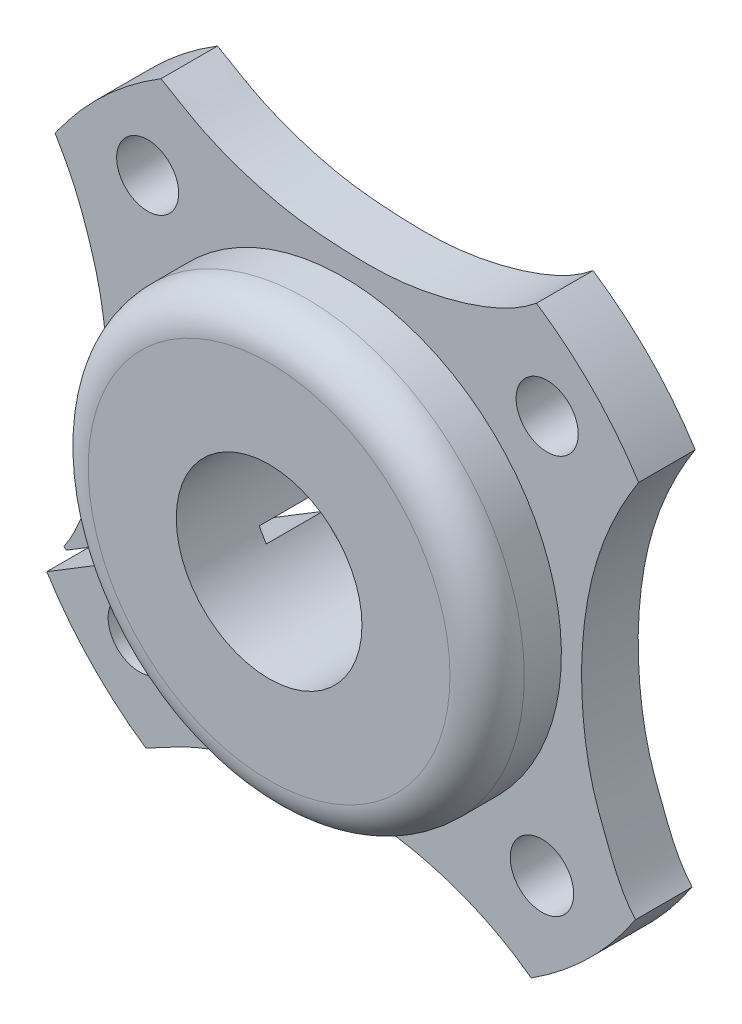
ISO-10303-21;
HEADER;
FILE_DESCRIPTION(('STEP AP214'),'2;1');
FILE_NAME('part.step','',(''),(''),'','','');
FILE_SCHEMA(('AUTOMOTIVE_DESIGN { 1 0 10303 214 1 1 1 1 }'));
ENDSEC;
DATA;
#1=APPLICATION_CONTEXT('core data for automotive mechanical design processes');
#2=APPLICATION_PROTOCOL_DEFINITION('international standard','automotive_design',2000,#1);
#3=PRODUCT_CONTEXT('',#1,'mechanical');
#4=PRODUCT('Part','Part','',(#3));
#5=PRODUCT_RELATED_PRODUCT_CATEGORY('part','',(#4));
#6=PRODUCT_DEFINITION_FORMATION('','',#4);
#7=PRODUCT_DEFINITION_CONTEXT('part definition',#1,'design');
#8=PRODUCT_DEFINITION('design','',#6,#7);
#9=PRODUCT_DEFINITION_SHAPE('','',#8);
#10=(LENGTH_UNIT() NAMED_UNIT(*) SI_UNIT(.MILLI.,.METRE.));
#11=(NAMED_UNIT(*) PLANE_ANGLE_UNIT() SI_UNIT($,.RADIAN.));
#12=(NAMED_UNIT(*) SI_UNIT($,.STERADIAN.) SOLID_ANGLE_UNIT());
#13=UNCERTAINTY_MEASURE_WITH_UNIT(LENGTH_MEASURE(1.E-05),#10,'distance_accuracy_value','');
#14=(GEOMETRIC_REPRESENTATION_CONTEXT(3) GLOBAL_UNCERTAINTY_ASSIGNED_CONTEXT((#13)) GLOBAL_UNIT_ASSIGNED_CONTEXT((#10,
#11,#12)) REPRESENTATION_CONTEXT('',''));
#15=CARTESIAN_POINT('',(0.,0.,0.));
#16=DIRECTION('',(0.,0.,1.));
#17=DIRECTION('',(1.,0.,0.));
#18=AXIS2_PLACEMENT_3D('',#15,#16,#17);
#19=CARTESIAN_POINT('',(0.658023507379732,32.5182262393393,7.62));
#20=DIRECTION('',(0.,0.,1.));
#21=DIRECTION('',(1.,0.,0.));
#22=AXIS2_PLACEMENT_3D('',#19,#20,#21);
#23=PLANE('',#22);
#24=CARTESIAN_POINT('',(0.,0.,7.62));
#25=DIRECTION('',(0.,0.,1.));
#26=DIRECTION('',(1.,0.,0.));
#27=AXIS2_PLACEMENT_3D('',#24,#25,#26);
#28=CIRCLE('',#27,29.35);
#29=CARTESIAN_POINT('',(-24.7729490374868,-15.7392342884297,7.62));
#30=VERTEX_POINT('',#29);
#31=CARTESIAN_POINT('',(-25.7376369008227,-14.1066135823382,7.62));
#32=VERTEX_POINT('',#31);
#33=EDGE_CURVE('E327',#30,#32,#28,.T.);
#34=ORIENTED_EDGE('',*,*,#33,.F.);
#35=DIRECTION('',(-0.854049752326533,-0.520191330714947,0.));
#36=VECTOR('',#35,1.);
#37=CARTESIAN_POINT('',(-10.2366495201512,-6.88535081267782,7.62));
#38=LINE('',#37,#36);
#39=CARTESIAN_POINT('',(-39.934023895353,-24.9736608354758,7.62));
#40=VERTEX_POINT('',#39);
#41=EDGE_CURVE('E154',#30,#40,#38,.T.);
#42=ORIENTED_EDGE('',*,*,#41,.T.);
#43=CARTESIAN_POINT('',(0.,0.,7.62));
#44=DIRECTION('',(0.,0.,1.));
#45=DIRECTION('',(1.,0.,0.));
#46=AXIS2_PLACEMENT_3D('',#43,#44,#45);
#47=CIRCLE('',#46,47.1);
#48=CARTESIAN_POINT('',(-26.6000238643067,-38.8696376419734,7.62));
#49=VERTEX_POINT('',#48);
#50=EDGE_CURVE('E160',#40,#49,#47,.T.);
#51=ORIENTED_EDGE('',*,*,#50,.T.);
#52=CARTESIAN_POINT('',(-26.6000238643067,-38.8696376419734,7.62));
#53=CARTESIAN_POINT('',(-24.761438400834,-37.9721190301308,7.62));
#54=CARTESIAN_POINT('',(-21.9035102085332,-36.2081640430123,7.62));
#55=CARTESIAN_POINT('',(-17.2178753799674,-34.3784391765745,7.62));
#56=CARTESIAN_POINT('',(-13.5896675946792,-33.0907066904228,7.62));
#57=CARTESIAN_POINT('',(-10.5853631843598,-32.6731197731958,7.62));
#58=CARTESIAN_POINT('',(-8.18071114087106,-32.0447527504983,7.62));
#59=CARTESIAN_POINT('',(-5.60903996701636,-31.712900837616,7.62));
#60=CARTESIAN_POINT('',(6.25105842718662,-31.3263606407199,7.62));
#61=CARTESIAN_POINT('',(17.1002147334403,-33.6549738289015,7.62));
#62=CARTESIAN_POINT('',(25.2699880614801,-39.7471722688879,7.62));
#63=B_SPLINE_CURVE_WITH_KNOTS('',3,(#52,#53,#54,#55,#56,#57,#58,#59,#60,#61,#62),.UNSPECIFIED.,
.F.,.F.,(4,1,1,1,1,1,1,1,4),(0.,0.112337385496684,0.183127320937301,0.275731790858903,
0.322385941652072,0.349032381859067,0.411967602300727,0.463999395586042,1.),.UNSPECIFIED.);
#64=CARTESIAN_POINT('',(25.2699880614801,-39.7471722688879,7.62));
#65=VERTEX_POINT('',#64);
#66=EDGE_CURVE('E162',#49,#65,#63,.T.);
#67=ORIENTED_EDGE('',*,*,#66,.T.);
#68=CARTESIAN_POINT('',(0.,0.,7.62));
#69=DIRECTION('',(0.,0.,1.));
#70=DIRECTION('',(1.,0.,0.));
#71=AXIS2_PLACEMENT_3D('',#68,#69,#70);
#72=CIRCLE('',#71,47.1);
#73=CARTESIAN_POINT('',(39.3260866432412,-25.9204342040848,7.62));
#74=VERTEX_POINT('',#73);
#75=EDGE_CURVE('E167',#65,#74,#72,.T.);
#76=ORIENTED_EDGE('',*,*,#75,.T.);
#77=CARTESIAN_POINT('',(39.3260866432412,-25.9204342040848,7.62));
#78=CARTESIAN_POINT('',(37.4921523011446,-23.8391156671852,7.62));
#79=CARTESIAN_POINT('',(35.8879411682811,-19.759926365877,7.62));
#80=CARTESIAN_POINT('',(33.3130690164233,-13.1880829511689,7.62));
#81=CARTESIAN_POINT('',(31.8734994464154,-4.86227763747989,7.62));
#82=CARTESIAN_POINT('',(32.0396885374761,4.75097146940117,7.62));
#83=CARTESIAN_POINT('',(34.3989883478762,15.5197239767927,7.62));
#84=CARTESIAN_POINT('',(37.5037899873926,21.7768012694652,7.62));
#85=CARTESIAN_POINT('',(39.7491459278347,25.2668834249042,7.62));
#86=B_SPLINE_CURVE_WITH_KNOTS('',3,(#77,#78,#79,#80,#81,#82,#83,#84,#85),.UNSPECIFIED.,.F.,.F.,
(4,1,1,1,1,1,4),(0.,0.152149228167361,0.240137859307162,0.391778364696544,0.616919879255594,
0.769442045713485,1.),.UNSPECIFIED.);
#87=CARTESIAN_POINT('',(39.7491459278347,25.2668834249042,7.62));
#88=VERTEX_POINT('',#87);
#89=EDGE_CURVE('E248',#74,#88,#86,.T.);
#90=ORIENTED_EDGE('',*,*,#89,.T.);
#91=CARTESIAN_POINT('',(0.,0.,7.62));
#92=DIRECTION('',(0.,0.,1.));
#93=DIRECTION('',(1.,0.,0.));
#94=AXIS2_PLACEMENT_3D('',#91,#92,#93);
#95=CIRCLE('',#94,47.1);
#96=CARTESIAN_POINT('',(25.9885677782829,39.28109398723,7.62));
#97=VERTEX_POINT('',#96);
#98=EDGE_CURVE('E253',#88,#97,#95,.T.);
#99=ORIENTED_EDGE('',*,*,#98,.T.);
#100=CARTESIAN_POINT('',(25.9885677782829,39.28109398723,7.62));
#101=CARTESIAN_POINT('',(23.5626499737918,37.2841040054628,7.62));
#102=CARTESIAN_POINT('',(19.1114436940508,35.2071507000259,7.62));
#103=CARTESIAN_POINT('',(12.2557120869569,33.297732954855,7.62));
#104=CARTESIAN_POINT('',(6.29273701401604,32.3811567935565,7.62));
#105=CARTESIAN_POINT('',(-0.437103172881479,32.4968679517725,7.62));
#106=CARTESIAN_POINT('',(-6.35688418447763,32.9682940730636,7.62));
#107=CARTESIAN_POINT('',(-11.5785676653979,34.185840708471,7.62));
#108=CARTESIAN_POINT('',(-15.7849574541841,35.5620858785475,7.62));
#109=CARTESIAN_POINT('',(-20.1644751816095,37.4934320850133,7.62));
#110=CARTESIAN_POINT('',(-22.9661703528994,39.3174012881997,7.62));
#111=CARTESIAN_POINT('',(-24.5628283407941,40.1880263747883,7.62));
#112=B_SPLINE_CURVE_WITH_KNOTS('',3,(#100,#101,#102,#103,#104,#105,#106,#107,#108,#109,#110,
#111),.UNSPECIFIED.,.F.,.F.,(4,1,1,1,1,1,1,1,1,4),(0.,0.175375239215378,0.27210556041958,
0.399541877681467,0.512308974981679,0.649499016717416,0.732089353955635,0.812760666670732,
0.897853457113931,1.),.UNSPECIFIED.);
#113=CARTESIAN_POINT('',(-24.5628283407941,40.1880263747883,7.62));
#114=VERTEX_POINT('',#113);
#115=EDGE_CURVE('E208',#97,#114,#112,.T.);
#116=ORIENTED_EDGE('',*,*,#115,.T.);
#117=CARTESIAN_POINT('',(0.,0.,7.62));
#118=DIRECTION('',(0.,0.,1.));
#119=DIRECTION('',(1.,0.,0.));
#120=AXIS2_PLACEMENT_3D('',#117,#118,#119);
#121=CIRCLE('',#120,47.1);
#122=CARTESIAN_POINT('',(-38.7984521151592,26.7037471802685,7.62));
#123=VERTEX_POINT('',#122);
#124=EDGE_CURVE('E203',#114,#123,#121,.T.);
#125=ORIENTED_EDGE('',*,*,#124,.T.);
#126=CARTESIAN_POINT('',(-38.7984521151592,26.7037471802685,7.62));
#127=CARTESIAN_POINT('',(-37.9506740299387,25.2771345147426,7.62));
#128=CARTESIAN_POINT('',(-36.6427851299884,22.9088705621625,7.62));
#129=CARTESIAN_POINT('',(-35.1491979523002,19.3129997874996,7.62));
#130=CARTESIAN_POINT('',(-33.9313001093165,15.746504912095,7.62));
#131=CARTESIAN_POINT('',(-32.9326727796586,12.2182354452535,7.62));
#132=CARTESIAN_POINT('',(-32.3136476771259,8.69331301060768,7.62));
#133=CARTESIAN_POINT('',(-31.7167724015896,4.09857673792019,7.62));
#134=CARTESIAN_POINT('',(-31.6349123018083,-1.09855036226479,7.62));
#135=CARTESIAN_POINT('',(-32.5071602190801,-6.52039330937994,7.62));
#136=CARTESIAN_POINT('',(-33.9432386402862,-12.8947596557199,7.62));
#137=CARTESIAN_POINT('',(-35.5775053456762,-17.8697044860191,7.62));
#138=CARTESIAN_POINT('',(-37.6346286866185,-20.9123447736141,7.62));
#139=B_SPLINE_CURVE_WITH_KNOTS('',3,(#126,#127,#128,#129,#130,#131,#132,#133,#134,#135,#136,
#137,#138),.UNSPECIFIED.,.F.,.F.,(4,1,1,1,1,1,1,1,1,1,4),(0.,0.0999297246437438,
0.162468274794587,0.234078024617363,0.3267081384704,0.382759028521336,0.449294790215428,
0.605596003030258,0.693195760398778,0.779016413113804,1.),.UNSPECIFIED.);
#140=CARTESIAN_POINT('',(-37.6346286866185,-20.9123447736141,7.62));
#141=VERTEX_POINT('',#140);
#142=EDGE_CURVE('E155',#123,#141,#139,.T.);
#143=ORIENTED_EDGE('',*,*,#142,.T.);
#144=DIRECTION('',(0.828426593134476,-0.560097652010438,0.));
#145=VECTOR('',#144,1.);
#146=CARTESIAN_POINT('',(-37.6346286866185,-20.9123447736141,7.62));
#147=LINE('',#146,#145);
#148=CARTESIAN_POINT('',(-37.2918129262293,-21.1441218605128,7.62));
#149=VERTEX_POINT('',#148);
#150=EDGE_CURVE('E152',#141,#149,#147,.T.);
#151=ORIENTED_EDGE('',*,*,#150,.T.);
#152=DIRECTION('',(0.854049752326534,0.520191330714946,0.));
#153=VECTOR('',#152,1.);
#154=CARTESIAN_POINT('',(-37.2918129262293,-21.1441218605128,7.62));
#155=LINE('',#154,#153);
#156=EDGE_CURVE('E151',#149,#32,#155,.T.);
#157=ORIENTED_EDGE('',*,*,#156,.T.);
#158=EDGE_LOOP('',(#34,#42,#51,#67,#76,#90,#99,#116,#125,#143,#151,#157));
#159=FACE_BOUND('',#158,.T.);
#160=CARTESIAN_POINT('',(-27.4557206208231,-26.2014596078229,7.62));
#161=DIRECTION('',(0.,0.,1.));
#162=DIRECTION('',(1.,0.,0.));
#163=AXIS2_PLACEMENT_3D('',#160,#161,#162);
#164=CIRCLE('',#163,4.21891219422189);
#165=CARTESIAN_POINT('',(-23.2368084266012,-26.2014596078229,7.62));
#166=VERTEX_POINT('',#165);
#167=EDGE_CURVE('E384',#166,#166,#164,.T.);
#168=ORIENTED_EDGE('',*,*,#167,.F.);
#169=EDGE_LOOP('',(#168));
#170=FACE_BOUND('',#169,.T.);
#171=CARTESIAN_POINT('',(27.4365140787092,26.8292225293373,7.62));
#172=DIRECTION('',(0.,0.,1.));
#173=DIRECTION('',(1.,0.,0.));
#174=AXIS2_PLACEMENT_3D('',#171,#172,#173);
#175=CIRCLE('',#174,4.1836760100465);
#176=CARTESIAN_POINT('',(31.6201900887557,26.8292225293373,7.62));
#177=VERTEX_POINT('',#176);
#178=EDGE_CURVE('E264',#177,#177,#175,.T.);
#179=ORIENTED_EDGE('',*,*,#178,.F.);
#180=EDGE_LOOP('',(#179));
#181=FACE_BOUND('',#180,.T.);
#182=CARTESIAN_POINT('',(-26.3485628473477,28.0149376800126,7.62));
#183=DIRECTION('',(0.,0.,1.));
#184=DIRECTION('',(1.,0.,0.));
#185=AXIS2_PLACEMENT_3D('',#182,#183,#184);
#186=CIRCLE('',#185,4.17543914453993);
#187=CARTESIAN_POINT('',(-22.1731237028078,28.0149376800126,7.62));
#188=VERTEX_POINT('',#187);
#189=EDGE_CURVE('E379',#188,#188,#186,.T.);
#190=ORIENTED_EDGE('',*,*,#189,.F.);
#191=EDGE_LOOP('',(#190));
#192=FACE_BOUND('',#191,.T.);
#193=CARTESIAN_POINT('',(26.7319255290467,-27.08988750177,7.62));
#194=DIRECTION('',(0.,0.,1.));
#195=DIRECTION('',(1.,0.,0.));
#196=AXIS2_PLACEMENT_3D('',#193,#194,#195);
#197=CIRCLE('',#196,4.27034427381951);
#198=CARTESIAN_POINT('',(31.0022698028662,-27.08988750177,7.62));
#199=VERTEX_POINT('',#198);
#200=EDGE_CURVE('E337',#199,#199,#197,.T.);
#201=ORIENTED_EDGE('',*,*,#200,.F.);
#202=EDGE_LOOP('',(#201));
#203=FACE_BOUND('',#202,.T.);
#204=ADVANCED_FACE('F35',(#159,#170,#181,#192,#203),#23,.T.);
#205=CARTESIAN_POINT('',(0.658023507379732,32.5182262393393,0.));
#206=DIRECTION('',(0.,0.,1.));
#207=DIRECTION('',(1.,0.,0.));
#208=AXIS2_PLACEMENT_3D('',#205,#206,#207);
#209=PLANE('',#208);
#210=CARTESIAN_POINT('',(-27.4557206208231,-26.2014596078229,0.));
#211=DIRECTION('',(0.,0.,1.));
#212=DIRECTION('',(1.,0.,0.));
#213=AXIS2_PLACEMENT_3D('',#210,#211,#212);
#214=CIRCLE('',#213,4.21891219422189);
#215=CARTESIAN_POINT('',(-23.2368084266012,-26.2014596078229,0.));
#216=VERTEX_POINT('',#215);
#217=EDGE_CURVE('E388',#216,#216,#214,.T.);
#218=ORIENTED_EDGE('',*,*,#217,.T.);
#219=EDGE_LOOP('',(#218));
#220=FACE_BOUND('',#219,.T.);
#221=CARTESIAN_POINT('',(27.4365140787092,26.8292225293373,0.));
#222=DIRECTION('',(0.,0.,1.));
#223=DIRECTION('',(1.,0.,0.));
#224=AXIS2_PLACEMENT_3D('',#221,#222,#223);
#225=CIRCLE('',#224,4.1836760100465);
#226=CARTESIAN_POINT('',(31.6201900887557,26.8292225293373,0.));
#227=VERTEX_POINT('',#226);
#228=EDGE_CURVE('E215',#227,#227,#225,.T.);
#229=ORIENTED_EDGE('',*,*,#228,.T.);
#230=EDGE_LOOP('',(#229));
#231=FACE_BOUND('',#230,.T.);
#232=DIRECTION('',(-0.854049752326533,-0.520191330714947,0.));
#233=VECTOR('',#232,1.);
#234=CARTESIAN_POINT('',(-10.2366495201512,-6.88535081267782,0.));
#235=LINE('',#234,#233);
#236=CARTESIAN_POINT('',(-10.3761556819575,-6.97032232136949,0.));
#237=VERTEX_POINT('',#236);
#238=CARTESIAN_POINT('',(-39.934023895353,-24.9736608354758,0.));
#239=VERTEX_POINT('',#238);
#240=EDGE_CURVE('E279',#237,#239,#235,.T.);
#241=ORIENTED_EDGE('',*,*,#240,.F.);
#242=CARTESIAN_POINT('',(0.,0.,0.));
#243=DIRECTION('',(0.,0.,1.));
#244=DIRECTION('',(1.,0.,0.));
#245=AXIS2_PLACEMENT_3D('',#242,#243,#244);
#246=CIRCLE('',#245,12.5);
#247=CARTESIAN_POINT('',(-11.3114790091779,-5.31981603299655,0.));
#248=VERTEX_POINT('',#247);
#249=EDGE_CURVE('E146',#237,#248,#246,.T.);
#250=ORIENTED_EDGE('',*,*,#249,.T.);
#251=DIRECTION('',(0.854049752326534,0.520191330714946,0.));
#252=VECTOR('',#251,1.);
#253=CARTESIAN_POINT('',(-37.2918129262293,-21.1441218605128,0.));
#254=LINE('',#253,#252);
#255=CARTESIAN_POINT('',(-37.2918129262293,-21.1441218605128,0.));
#256=VERTEX_POINT('',#255);
#257=EDGE_CURVE('E145',#256,#248,#254,.T.);
#258=ORIENTED_EDGE('',*,*,#257,.F.);
#259=DIRECTION('',(0.828426593134476,-0.560097652010438,0.));
#260=VECTOR('',#259,1.);
#261=CARTESIAN_POINT('',(-37.6346286866185,-20.9123447736141,0.));
#262=LINE('',#261,#260);
#263=CARTESIAN_POINT('',(-37.6346286866185,-20.9123447736141,0.));
#264=VERTEX_POINT('',#263);
#265=EDGE_CURVE('E273',#264,#256,#262,.T.);
#266=ORIENTED_EDGE('',*,*,#265,.F.);
#267=CARTESIAN_POINT('',(-38.7984521151592,26.7037471802685,0.));
#268=CARTESIAN_POINT('',(-37.9506740299387,25.2771345147426,0.));
#269=CARTESIAN_POINT('',(-36.6427851299884,22.9088705621625,0.));
#270=CARTESIAN_POINT('',(-35.1491979523002,19.3129997874996,0.));
#271=CARTESIAN_POINT('',(-33.9313001093165,15.746504912095,0.));
#272=CARTESIAN_POINT('',(-32.9326727796586,12.2182354452535,0.));
#273=CARTESIAN_POINT('',(-32.3136476771259,8.69331301060768,0.));
#274=CARTESIAN_POINT('',(-31.7167724015896,4.09857673792019,0.));
#275=CARTESIAN_POINT('',(-31.6349123018083,-1.09855036226479,0.));
#276=CARTESIAN_POINT('',(-32.5071602190801,-6.52039330937994,0.));
#277=CARTESIAN_POINT('',(-33.9432386402862,-12.8947596557199,0.));
#278=CARTESIAN_POINT('',(-35.5775053456762,-17.8697044860191,0.));
#279=CARTESIAN_POINT('',(-37.6346286866185,-20.9123447736141,0.));
#280=B_SPLINE_CURVE_WITH_KNOTS('',3,(#267,#268,#269,#270,#271,#272,#273,#274,#275,#276,#277,
#278,#279),.UNSPECIFIED.,.F.,.F.,(4,1,1,1,1,1,1,1,1,1,4),(0.,0.0999297246437438,
0.162468274794587,0.234078024617363,0.3267081384704,0.382759028521336,0.449294790215428,
0.605596003030258,0.693195760398778,0.779016413113804,1.),.UNSPECIFIED.);
#281=CARTESIAN_POINT('',(-38.7984521151592,26.7037471802685,0.));
#282=VERTEX_POINT('',#281);
#283=EDGE_CURVE('E269',#282,#264,#280,.T.);
#284=ORIENTED_EDGE('',*,*,#283,.F.);
#285=CARTESIAN_POINT('',(0.,0.,0.));
#286=DIRECTION('',(0.,0.,1.));
#287=DIRECTION('',(1.,0.,0.));
#288=AXIS2_PLACEMENT_3D('',#285,#286,#287);
#289=CIRCLE('',#288,47.1);
#290=CARTESIAN_POINT('',(-24.5628283407941,40.1880263747883,0.));
#291=VERTEX_POINT('',#290);
#292=EDGE_CURVE('E263',#291,#282,#289,.T.);
#293=ORIENTED_EDGE('',*,*,#292,.F.);
#294=CARTESIAN_POINT('',(25.9885677782829,39.28109398723,0.));
#295=CARTESIAN_POINT('',(23.5626499737918,37.2841040054628,0.));
#296=CARTESIAN_POINT('',(19.1114436940508,35.2071507000259,0.));
#297=CARTESIAN_POINT('',(12.2557120869569,33.297732954855,0.));
#298=CARTESIAN_POINT('',(6.29273701401604,32.3811567935565,0.));
#299=CARTESIAN_POINT('',(-0.437103172881479,32.4968679517725,0.));
#300=CARTESIAN_POINT('',(-6.35688418447763,32.9682940730636,0.));
#301=CARTESIAN_POINT('',(-11.5785676653979,34.185840708471,0.));
#302=CARTESIAN_POINT('',(-15.7849574541841,35.5620858785475,0.));
#303=CARTESIAN_POINT('',(-20.1644751816095,37.4934320850133,0.));
#304=CARTESIAN_POINT('',(-22.9661703528994,39.3174012881997,0.));
#305=CARTESIAN_POINT('',(-24.5628283407941,40.1880263747883,0.));
#306=B_SPLINE_CURVE_WITH_KNOTS('',3,(#294,#295,#296,#297,#298,#299,#300,#301,#302,#303,#304,
#305),.UNSPECIFIED.,.F.,.F.,(4,1,1,1,1,1,1,1,1,4),(0.,0.175375239215378,0.27210556041958,
0.399541877681467,0.512308974981679,0.649499016717416,0.732089353955635,0.812760666670732,
0.897853457113931,1.),.UNSPECIFIED.);
#307=CARTESIAN_POINT('',(25.9885677782829,39.28109398723,0.));
#308=VERTEX_POINT('',#307);
#309=EDGE_CURVE('E259',#308,#291,#306,.T.);
#310=ORIENTED_EDGE('',*,*,#309,.F.);
#311=CARTESIAN_POINT('',(0.,0.,0.));
#312=DIRECTION('',(0.,0.,1.));
#313=DIRECTION('',(1.,0.,0.));
#314=AXIS2_PLACEMENT_3D('',#311,#312,#313);
#315=CIRCLE('',#314,47.1);
#316=CARTESIAN_POINT('',(39.7491459278347,25.2668834249042,0.));
#317=VERTEX_POINT('',#316);
#318=EDGE_CURVE('E214',#317,#308,#315,.T.);
#319=ORIENTED_EDGE('',*,*,#318,.F.);
#320=CARTESIAN_POINT('',(39.3260866432412,-25.9204342040848,0.));
#321=CARTESIAN_POINT('',(37.4921523011446,-23.8391156671852,0.));
#322=CARTESIAN_POINT('',(35.8879411682811,-19.759926365877,0.));
#323=CARTESIAN_POINT('',(33.3130690164233,-13.1880829511689,0.));
#324=CARTESIAN_POINT('',(31.8734994464154,-4.86227763747989,0.));
#325=CARTESIAN_POINT('',(32.0396885374761,4.75097146940117,0.));
#326=CARTESIAN_POINT('',(34.3989883478762,15.5197239767927,0.));
#327=CARTESIAN_POINT('',(37.5037899873926,21.7768012694652,0.));
#328=CARTESIAN_POINT('',(39.7491459278347,25.2668834249042,0.));
#329=B_SPLINE_CURVE_WITH_KNOTS('',3,(#320,#321,#322,#323,#324,#325,#326,#327,#328),
.UNSPECIFIED.,.F.,.F.,(4,1,1,1,1,1,4),(0.,0.152149228167361,0.240137859307162,0.391778364696544,
0.616919879255594,0.769442045713485,1.),.UNSPECIFIED.);
#330=CARTESIAN_POINT('',(39.3260866432412,-25.9204342040848,0.));
#331=VERTEX_POINT('',#330);
#332=EDGE_CURVE('E292',#331,#317,#329,.T.);
#333=ORIENTED_EDGE('',*,*,#332,.F.);
#334=CARTESIAN_POINT('',(0.,0.,0.));
#335=DIRECTION('',(0.,0.,1.));
#336=DIRECTION('',(1.,0.,0.));
#337=AXIS2_PLACEMENT_3D('',#334,#335,#336);
#338=CIRCLE('',#337,47.1);
#339=CARTESIAN_POINT('',(25.2699880614801,-39.7471722688879,0.));
#340=VERTEX_POINT('',#339);
#341=EDGE_CURVE('E287',#340,#331,#338,.T.);
#342=ORIENTED_EDGE('',*,*,#341,.F.);
#343=CARTESIAN_POINT('',(-26.6000238643067,-38.8696376419734,0.));
#344=CARTESIAN_POINT('',(-24.761438400834,-37.9721190301308,0.));
#345=CARTESIAN_POINT('',(-21.9035102085332,-36.2081640430123,0.));
#346=CARTESIAN_POINT('',(-17.2178753799674,-34.3784391765745,0.));
#347=CARTESIAN_POINT('',(-13.5896675946792,-33.0907066904228,0.));
#348=CARTESIAN_POINT('',(-10.5853631843598,-32.6731197731958,0.));
#349=CARTESIAN_POINT('',(-8.18071114087106,-32.0447527504983,0.));
#350=CARTESIAN_POINT('',(-5.60903996701636,-31.712900837616,0.));
#351=CARTESIAN_POINT('',(6.25105842718662,-31.3263606407199,0.));
#352=CARTESIAN_POINT('',(17.1002147334403,-33.6549738289015,0.));
#353=CARTESIAN_POINT('',(25.2699880614801,-39.7471722688879,0.));
#354=B_SPLINE_CURVE_WITH_KNOTS('',3,(#343,#344,#345,#346,#347,#348,#349,#350,#351,#352,#353),
.UNSPECIFIED.,.F.,.F.,(4,1,1,1,1,1,1,1,4),(0.,0.112337385496684,0.183127320937301,
0.275731790858903,0.322385941652072,0.349032381859067,0.411967602300727,0.463999395586042,1.),.UNSPECIFIED.);
#355=CARTESIAN_POINT('',(-26.6000238643067,-38.8696376419734,0.));
#356=VERTEX_POINT('',#355);
#357=EDGE_CURVE('E283',#356,#340,#354,.T.);
#358=ORIENTED_EDGE('',*,*,#357,.F.);
#359=CARTESIAN_POINT('',(0.,0.,0.));
#360=DIRECTION('',(0.,0.,1.));
#361=DIRECTION('',(1.,0.,0.));
#362=AXIS2_PLACEMENT_3D('',#359,#360,#361);
#363=CIRCLE('',#362,47.1);
#364=EDGE_CURVE('E281',#239,#356,#363,.T.);
#365=ORIENTED_EDGE('',*,*,#364,.F.);
#366=EDGE_LOOP('',(#241,#250,#258,#266,#284,#293,#310,#319,#333,#342,#358,#365));
#367=FACE_BOUND('',#366,.T.);
#368=CARTESIAN_POINT('',(-26.3485628473477,28.0149376800126,0.));
#369=DIRECTION('',(0.,0.,1.));
#370=DIRECTION('',(1.,0.,0.));
#371=AXIS2_PLACEMENT_3D('',#368,#369,#370);
#372=CIRCLE('',#371,4.17543914453993);
#373=CARTESIAN_POINT('',(-22.1731237028078,28.0149376800126,0.));
#374=VERTEX_POINT('',#373);
#375=EDGE_CURVE('E382',#374,#374,#372,.T.);
#376=ORIENTED_EDGE('',*,*,#375,.T.);
#377=EDGE_LOOP('',(#376));
#378=FACE_BOUND('',#377,.T.);
#379=CARTESIAN_POINT('',(26.7319255290467,-27.08988750177,0.));
#380=DIRECTION('',(0.,0.,1.));
#381=DIRECTION('',(1.,0.,0.));
#382=AXIS2_PLACEMENT_3D('',#379,#380,#381);
#383=CIRCLE('',#382,4.27034427381951);
#384=CARTESIAN_POINT('',(31.0022698028662,-27.08988750177,0.));
#385=VERTEX_POINT('',#384);
#386=EDGE_CURVE('E335',#385,#385,#383,.T.);
#387=ORIENTED_EDGE('',*,*,#386,.T.);
#388=EDGE_LOOP('',(#387));
#389=FACE_BOUND('',#388,.T.);
#390=ADVANCED_FACE('F222',(#220,#231,#367,#378,#389),#209,.F.);
#391=DIRECTION('',(0.,0.,-1.));
#392=VECTOR('',#391,1.);
#393=SURFACE_OF_LINEAR_EXTRUSION('',#112,#392);
#394=ORIENTED_EDGE('',*,*,#309,.T.);
#395=DIRECTION('',(0.,0.,-1.));
#396=VECTOR('',#395,1.);
#397=CARTESIAN_POINT('',(-24.5628283407941,40.1880263747883,7.62));
#398=LINE('',#397,#396);
#399=EDGE_CURVE('E325',#114,#291,#398,.T.);
#400=ORIENTED_EDGE('',*,*,#399,.F.);
#401=ORIENTED_EDGE('',*,*,#115,.F.);
#402=DIRECTION('',(0.,0.,-1.));
#403=VECTOR('',#402,1.);
#404=CARTESIAN_POINT('',(25.9885677782829,39.28109398723,7.62));
#405=LINE('',#404,#403);
#406=EDGE_CURVE('E258',#97,#308,#405,.T.);
#407=ORIENTED_EDGE('',*,*,#406,.T.);
#408=EDGE_LOOP('',(#394,#400,#401,#407));
#409=FACE_BOUND('',#408,.T.);
#410=ADVANCED_FACE('F220',(#409),#393,.F.);
#411=CARTESIAN_POINT('',(0.,0.,7.62));
#412=DIRECTION('',(0.,0.,-1.));
#413=DIRECTION('',(-1.,0.,0.));
#414=AXIS2_PLACEMENT_3D('',#411,#412,#413);
#415=CYLINDRICAL_SURFACE('',#414,47.1);
#416=ORIENTED_EDGE('',*,*,#292,.T.);
#417=DIRECTION('',(0.,0.,-1.));
#418=VECTOR('',#417,1.);
#419=CARTESIAN_POINT('',(-38.7984521151592,26.7037471802685,7.62));
#420=LINE('',#419,#418);
#421=EDGE_CURVE('E322',#123,#282,#420,.T.);
#422=ORIENTED_EDGE('',*,*,#421,.F.);
#423=ORIENTED_EDGE('',*,*,#124,.F.);
#424=ORIENTED_EDGE('',*,*,#399,.T.);
#425=EDGE_LOOP('',(#416,#422,#423,#424));
#426=FACE_BOUND('',#425,.T.);
#427=ADVANCED_FACE('F197',(#426),#415,.T.);
#428=DIRECTION('',(0.,0.,-1.));
#429=VECTOR('',#428,1.);
#430=SURFACE_OF_LINEAR_EXTRUSION('',#139,#429);
#431=ORIENTED_EDGE('',*,*,#283,.T.);
#432=DIRECTION('',(0.,0.,-1.));
#433=VECTOR('',#432,1.);
#434=CARTESIAN_POINT('',(-37.6346286866185,-20.9123447736141,7.62));
#435=LINE('',#434,#433);
#436=EDGE_CURVE('E319',#141,#264,#435,.T.);
#437=ORIENTED_EDGE('',*,*,#436,.F.);
#438=ORIENTED_EDGE('',*,*,#142,.F.);
#439=ORIENTED_EDGE('',*,*,#421,.T.);
#440=EDGE_LOOP('',(#431,#437,#438,#439));
#441=FACE_BOUND('',#440,.T.);
#442=ADVANCED_FACE('F193',(#441),#430,.F.);
#443=CARTESIAN_POINT('',(-37.6346286866185,-20.9123447736141,7.62));
#444=DIRECTION('',(0.560097652010438,0.828426593134476,0.));
#445=DIRECTION('',(-0.828426593134476,0.560097652010438,0.));
#446=AXIS2_PLACEMENT_3D('',#443,#444,#445);
#447=PLANE('',#446);
#448=ORIENTED_EDGE('',*,*,#265,.T.);
#449=DIRECTION('',(0.,0.,-1.));
#450=VECTOR('',#449,1.);
#451=CARTESIAN_POINT('',(-37.2918129262293,-21.1441218605128,7.62));
#452=LINE('',#451,#450);
#453=EDGE_CURVE('E317',#149,#256,#452,.T.);
#454=ORIENTED_EDGE('',*,*,#453,.F.);
#455=ORIENTED_EDGE('',*,*,#150,.F.);
#456=ORIENTED_EDGE('',*,*,#436,.T.);
#457=EDGE_LOOP('',(#448,#454,#455,#456));
#458=FACE_BOUND('',#457,.T.);
#459=ADVANCED_FACE('F190',(#458),#447,.F.);
#460=CARTESIAN_POINT('',(-37.2918129262293,-21.1441218605128,7.62));
#461=DIRECTION('',(-0.520191330714946,0.854049752326534,0.));
#462=DIRECTION('',(-0.854049752326534,-0.520191330714946,0.));
#463=AXIS2_PLACEMENT_3D('',#460,#461,#462);
#464=PLANE('',#463);
#465=ORIENTED_EDGE('',*,*,#257,.T.);
#466=DIRECTION('',(0.,0.,1.));
#467=VECTOR('',#466,1.);
#468=CARTESIAN_POINT('',(-11.3114790091779,-5.31981603299655,-8.38000000000001));
#469=LINE('',#468,#467);
#470=CARTESIAN_POINT('',(-11.3114790091779,-5.31981603299655,7.62));
#471=VERTEX_POINT('',#470);
#472=EDGE_CURVE('E131',#248,#471,#469,.T.);
#473=ORIENTED_EDGE('',*,*,#472,.T.);
#474=EDGE_CURVE('E141',#32,#471,#155,.T.);
#475=ORIENTED_EDGE('',*,*,#474,.F.);
#476=ORIENTED_EDGE('',*,*,#156,.F.);
#477=ORIENTED_EDGE('',*,*,#453,.T.);
#478=EDGE_LOOP('',(#465,#473,#475,#476,#477));
#479=FACE_BOUND('',#478,.T.);
#480=ADVANCED_FACE('F139',(#479),#464,.F.);
#481=CARTESIAN_POINT('',(-10.2366495201512,-6.88535081267782,7.62));
#482=DIRECTION('',(0.520191330714947,-0.854049752326533,0.));
#483=DIRECTION('',(0.854049752326534,0.520191330714947,0.));
#484=AXIS2_PLACEMENT_3D('',#481,#482,#483);
#485=PLANE('',#484);
#486=CARTESIAN_POINT('',(-10.3761556819575,-6.97032232136949,7.62));
#487=VERTEX_POINT('',#486);
#488=EDGE_CURVE('E57',#487,#30,#38,.T.);
#489=ORIENTED_EDGE('',*,*,#488,.F.);
#490=DIRECTION('',(0.,0.,1.));
#491=VECTOR('',#490,1.);
#492=CARTESIAN_POINT('',(-10.3761556819575,-6.97032232136949,-8.38000000000001));
#493=LINE('',#492,#491);
#494=EDGE_CURVE('E50',#487,#237,#493,.F.);
#495=ORIENTED_EDGE('',*,*,#494,.T.);
#496=ORIENTED_EDGE('',*,*,#240,.T.);
#497=DIRECTION('',(0.,0.,-1.));
#498=VECTOR('',#497,1.);
#499=CARTESIAN_POINT('',(-39.934023895353,-24.9736608354758,7.62));
#500=LINE('',#499,#498);
#501=EDGE_CURVE('E314',#40,#239,#500,.T.);
#502=ORIENTED_EDGE('',*,*,#501,.F.);
#503=ORIENTED_EDGE('',*,*,#41,.F.);
#504=EDGE_LOOP('',(#489,#495,#496,#502,#503));
#505=FACE_BOUND('',#504,.T.);
#506=ADVANCED_FACE('F183',(#505),#485,.F.);
#507=CARTESIAN_POINT('',(0.,0.,7.62));
#508=DIRECTION('',(0.,0.,-1.));
#509=DIRECTION('',(-1.,0.,0.));
#510=AXIS2_PLACEMENT_3D('',#507,#508,#509);
#511=CYLINDRICAL_SURFACE('',#510,47.1);
#512=ORIENTED_EDGE('',*,*,#364,.T.);
#513=DIRECTION('',(0.,0.,-1.));
#514=VECTOR('',#513,1.);
#515=CARTESIAN_POINT('',(-26.6000238643067,-38.8696376419734,7.62));
#516=LINE('',#515,#514);
#517=EDGE_CURVE('E311',#49,#356,#516,.T.);
#518=ORIENTED_EDGE('',*,*,#517,.F.);
#519=ORIENTED_EDGE('',*,*,#50,.F.);
#520=ORIENTED_EDGE('',*,*,#501,.T.);
#521=EDGE_LOOP('',(#512,#518,#519,#520));
#522=FACE_BOUND('',#521,.T.);
#523=ADVANCED_FACE('F178',(#522),#511,.T.);
#524=DIRECTION('',(0.,0.,-1.));
#525=VECTOR('',#524,1.);
#526=SURFACE_OF_LINEAR_EXTRUSION('',#63,#525);
#527=ORIENTED_EDGE('',*,*,#357,.T.);
#528=DIRECTION('',(0.,0.,-1.));
#529=VECTOR('',#528,1.);
#530=CARTESIAN_POINT('',(25.2699880614801,-39.7471722688879,7.62));
#531=LINE('',#530,#529);
#532=EDGE_CURVE('E308',#65,#340,#531,.T.);
#533=ORIENTED_EDGE('',*,*,#532,.F.);
#534=ORIENTED_EDGE('',*,*,#66,.F.);
#535=ORIENTED_EDGE('',*,*,#517,.T.);
#536=EDGE_LOOP('',(#527,#533,#534,#535));
#537=FACE_BOUND('',#536,.T.);
#538=ADVANCED_FACE('F173',(#537),#526,.F.);
#539=CARTESIAN_POINT('',(0.,0.,7.62));
#540=DIRECTION('',(0.,0.,-1.));
#541=DIRECTION('',(-1.,0.,0.));
#542=AXIS2_PLACEMENT_3D('',#539,#540,#541);
#543=CYLINDRICAL_SURFACE('',#542,47.1);
#544=ORIENTED_EDGE('',*,*,#341,.T.);
#545=DIRECTION('',(0.,0.,-1.));
#546=VECTOR('',#545,1.);
#547=CARTESIAN_POINT('',(39.3260866432412,-25.9204342040848,7.62));
#548=LINE('',#547,#546);
#549=EDGE_CURVE('E305',#74,#331,#548,.T.);
#550=ORIENTED_EDGE('',*,*,#549,.F.);
#551=ORIENTED_EDGE('',*,*,#75,.F.);
#552=ORIENTED_EDGE('',*,*,#532,.T.);
#553=EDGE_LOOP('',(#544,#550,#551,#552));
#554=FACE_BOUND('',#553,.T.);
#555=ADVANCED_FACE('F177',(#554),#543,.T.);
#556=DIRECTION('',(0.,0.,-1.));
#557=VECTOR('',#556,1.);
#558=SURFACE_OF_LINEAR_EXTRUSION('',#86,#557);
#559=ORIENTED_EDGE('',*,*,#332,.T.);
#560=DIRECTION('',(0.,0.,-1.));
#561=VECTOR('',#560,1.);
#562=CARTESIAN_POINT('',(39.7491459278347,25.2668834249042,7.62));
#563=LINE('',#562,#561);
#564=EDGE_CURVE('E302',#88,#317,#563,.T.);
#565=ORIENTED_EDGE('',*,*,#564,.F.);
#566=ORIENTED_EDGE('',*,*,#89,.F.);
#567=ORIENTED_EDGE('',*,*,#549,.T.);
#568=EDGE_LOOP('',(#559,#565,#566,#567));
#569=FACE_BOUND('',#568,.T.);
#570=ADVANCED_FACE('F244',(#569),#558,.F.);
#571=CARTESIAN_POINT('',(0.,0.,7.62));
#572=DIRECTION('',(0.,0.,-1.));
#573=DIRECTION('',(-1.,0.,0.));
#574=AXIS2_PLACEMENT_3D('',#571,#572,#573);
#575=CYLINDRICAL_SURFACE('',#574,47.1);
#576=ORIENTED_EDGE('',*,*,#318,.T.);
#577=ORIENTED_EDGE('',*,*,#406,.F.);
#578=ORIENTED_EDGE('',*,*,#98,.F.);
#579=ORIENTED_EDGE('',*,*,#564,.T.);
#580=EDGE_LOOP('',(#576,#577,#578,#579));
#581=FACE_BOUND('',#580,.T.);
#582=ADVANCED_FACE('F242',(#581),#575,.T.);
#583=CARTESIAN_POINT('',(27.4365140787092,26.8292225293373,7.62));
#584=DIRECTION('',(0.,0.,-1.));
#585=DIRECTION('',(-1.,0.,0.));
#586=AXIS2_PLACEMENT_3D('',#583,#584,#585);
#587=CYLINDRICAL_SURFACE('',#586,4.1836760100465);
#588=ORIENTED_EDGE('',*,*,#178,.T.);
#589=EDGE_LOOP('',(#588));
#590=FACE_BOUND('',#589,.T.);
#591=ORIENTED_EDGE('',*,*,#228,.F.);
#592=EDGE_LOOP('',(#591));
#593=FACE_BOUND('',#592,.T.);
#594=ADVANCED_FACE('F239',(#590,#593),#587,.F.);
#595=CARTESIAN_POINT('',(-26.3485628473477,28.0149376800126,7.62));
#596=DIRECTION('',(0.,0.,-1.));
#597=DIRECTION('',(-1.,0.,0.));
#598=AXIS2_PLACEMENT_3D('',#595,#596,#597);
#599=CYLINDRICAL_SURFACE('',#598,4.17543914453993);
#600=ORIENTED_EDGE('',*,*,#189,.T.);
#601=EDGE_LOOP('',(#600));
#602=FACE_BOUND('',#601,.T.);
#603=ORIENTED_EDGE('',*,*,#375,.F.);
#604=EDGE_LOOP('',(#603));
#605=FACE_BOUND('',#604,.T.);
#606=ADVANCED_FACE('F368',(#602,#605),#599,.F.);
#607=CARTESIAN_POINT('',(-27.4557206208231,-26.2014596078229,7.62));
#608=DIRECTION('',(0.,0.,-1.));
#609=DIRECTION('',(-1.,0.,0.));
#610=AXIS2_PLACEMENT_3D('',#607,#608,#609);
#611=CYLINDRICAL_SURFACE('',#610,4.21891219422189);
#612=ORIENTED_EDGE('',*,*,#167,.T.);
#613=EDGE_LOOP('',(#612));
#614=FACE_BOUND('',#613,.T.);
#615=ORIENTED_EDGE('',*,*,#217,.F.);
#616=EDGE_LOOP('',(#615));
#617=FACE_BOUND('',#616,.T.);
#618=ADVANCED_FACE('F365',(#614,#617),#611,.F.);
#619=CARTESIAN_POINT('',(26.7319255290467,-27.08988750177,7.62));
#620=DIRECTION('',(0.,0.,-1.));
#621=DIRECTION('',(-1.,0.,0.));
#622=AXIS2_PLACEMENT_3D('',#619,#620,#621);
#623=CYLINDRICAL_SURFACE('',#622,4.27034427381951);
#624=ORIENTED_EDGE('',*,*,#200,.T.);
#625=EDGE_LOOP('',(#624));
#626=FACE_BOUND('',#625,.T.);
#627=ORIENTED_EDGE('',*,*,#386,.F.);
#628=EDGE_LOOP('',(#627));
#629=FACE_BOUND('',#628,.T.);
#630=ADVANCED_FACE('F361',(#626,#629),#623,.F.);
#631=CARTESIAN_POINT('',(0.,0.,7.62));
#632=DIRECTION('',(0.,0.,1.));
#633=DIRECTION('',(1.,0.,0.));
#634=AXIS2_PLACEMENT_3D('',#631,#632,#633);
#635=PLANE('',#634);
#636=ORIENTED_EDGE('',*,*,#474,.T.);
#637=CARTESIAN_POINT('',(0.,0.,7.62));
#638=DIRECTION('',(0.,0.,1.));
#639=DIRECTION('',(1.,0.,0.));
#640=AXIS2_PLACEMENT_3D('',#637,#638,#639);
#641=CIRCLE('',#640,12.5);
#642=EDGE_CURVE('E128',#471,#487,#641,.T.);
#643=ORIENTED_EDGE('',*,*,#642,.T.);
#644=ORIENTED_EDGE('',*,*,#488,.T.);
#645=EDGE_CURVE('E150',#32,#30,#28,.T.);
#646=ORIENTED_EDGE('',*,*,#645,.F.);
#647=EDGE_LOOP('',(#636,#643,#644,#646));
#648=FACE_BOUND('',#647,.T.);
#649=ADVANCED_FACE('F148',(#648),#635,.F.);
#650=CARTESIAN_POINT('',(0.,0.,17.62));
#651=DIRECTION('',(0.,0.,-1.));
#652=DIRECTION('',(-1.,0.,0.));
#653=AXIS2_PLACEMENT_3D('',#650,#651,#652);
#654=CYLINDRICAL_SURFACE('',#653,29.35);
#655=CARTESIAN_POINT('',(0.,0.,12.62));
#656=DIRECTION('',(0.,0.,1.));
#657=DIRECTION('',(1.,0.,0.));
#658=AXIS2_PLACEMENT_3D('',#655,#656,#657);
#659=CIRCLE('',#658,29.35);
#660=CARTESIAN_POINT('',(29.35,0.,12.62));
#661=VERTEX_POINT('',#660);
#662=EDGE_CURVE('E11',#661,#661,#659,.F.);
#663=ORIENTED_EDGE('',*,*,#662,.T.);
#664=EDGE_LOOP('',(#663));
#665=FACE_BOUND('',#664,.T.);
#666=ORIENTED_EDGE('',*,*,#645,.T.);
#667=ORIENTED_EDGE('',*,*,#33,.T.);
#668=EDGE_LOOP('',(#666,#667));
#669=FACE_BOUND('',#668,.T.);
#670=ADVANCED_FACE('F349',(#665,#669),#654,.T.);
#671=CARTESIAN_POINT('',(0.,0.,17.62));
#672=DIRECTION('',(0.,0.,1.));
#673=DIRECTION('',(1.,0.,0.));
#674=AXIS2_PLACEMENT_3D('',#671,#672,#673);
#675=PLANE('',#674);
#676=CARTESIAN_POINT('',(0.,0.,17.62));
#677=DIRECTION('',(0.,0.,1.));
#678=DIRECTION('',(1.,0.,0.));
#679=AXIS2_PLACEMENT_3D('',#676,#677,#678);
#680=CIRCLE('',#679,12.5);
#681=CARTESIAN_POINT('',(12.5,0.,17.62));
#682=VERTEX_POINT('',#681);
#683=EDGE_CURVE('E134',#682,#682,#680,.T.);
#684=ORIENTED_EDGE('',*,*,#683,.F.);
#685=EDGE_LOOP('',(#684));
#686=FACE_BOUND('',#685,.T.);
#687=CARTESIAN_POINT('',(0.,0.,17.62));
#688=DIRECTION('',(0.,0.,1.));
#689=DIRECTION('',(1.,0.,0.));
#690=AXIS2_PLACEMENT_3D('',#687,#688,#689);
#691=CIRCLE('',#690,24.35);
#692=CARTESIAN_POINT('',(24.35,0.,17.62));
#693=VERTEX_POINT('',#692);
#694=EDGE_CURVE('E43',#693,#693,#691,.T.);
#695=ORIENTED_EDGE('',*,*,#694,.T.);
#696=EDGE_LOOP('',(#695));
#697=FACE_BOUND('',#696,.T.);
#698=ADVANCED_FACE('F347',(#686,#697),#675,.T.);
#699=CARTESIAN_POINT('',(0.,0.,12.62));
#700=DIRECTION('',(0.,0.,1.));
#701=DIRECTION('',(1.,0.,0.));
#702=AXIS2_PLACEMENT_3D('',#699,#700,#701);
#703=TOROIDAL_SURFACE('',#702,24.35,5.);
#704=ORIENTED_EDGE('',*,*,#662,.F.);
#705=EDGE_LOOP('',(#704));
#706=FACE_BOUND('',#705,.T.);
#707=ORIENTED_EDGE('',*,*,#694,.F.);
#708=EDGE_LOOP('',(#707));
#709=FACE_BOUND('',#708,.T.);
#710=ADVANCED_FACE('F37',(#706,#709),#703,.T.);
#711=CARTESIAN_POINT('',(0.,0.,-8.38000000000001));
#712=DIRECTION('',(0.,0.,1.));
#713=DIRECTION('',(1.,0.,0.));
#714=AXIS2_PLACEMENT_3D('',#711,#712,#713);
#715=CYLINDRICAL_SURFACE('',#714,12.5);
#716=ORIENTED_EDGE('',*,*,#683,.T.);
#717=EDGE_LOOP('',(#716));
#718=FACE_BOUND('',#717,.T.);
#719=ORIENTED_EDGE('',*,*,#494,.F.);
#720=ORIENTED_EDGE('',*,*,#642,.F.);
#721=ORIENTED_EDGE('',*,*,#472,.F.);
#722=ORIENTED_EDGE('',*,*,#249,.F.);
#723=EDGE_LOOP('',(#719,#720,#721,#722));
#724=FACE_BOUND('',#723,.T.);
#725=ADVANCED_FACE('F130',(#718,#724),#715,.F.);
#726=CLOSED_SHELL('',(#204,#390,#410,#427,#442,#459,#480,#506,#523,#538,#555,#570,#582,#594,
#606,#618,#630,#649,#670,#698,#710,#725));
#727=MANIFOLD_SOLID_BREP('B2',#726);
#728=ADVANCED_BREP_SHAPE_REPRESENTATION('',(#18,#727),#14);
#729=SHAPE_DEFINITION_REPRESENTATION(#9,#728);
ENDSEC;
END-ISO-10303-21;
